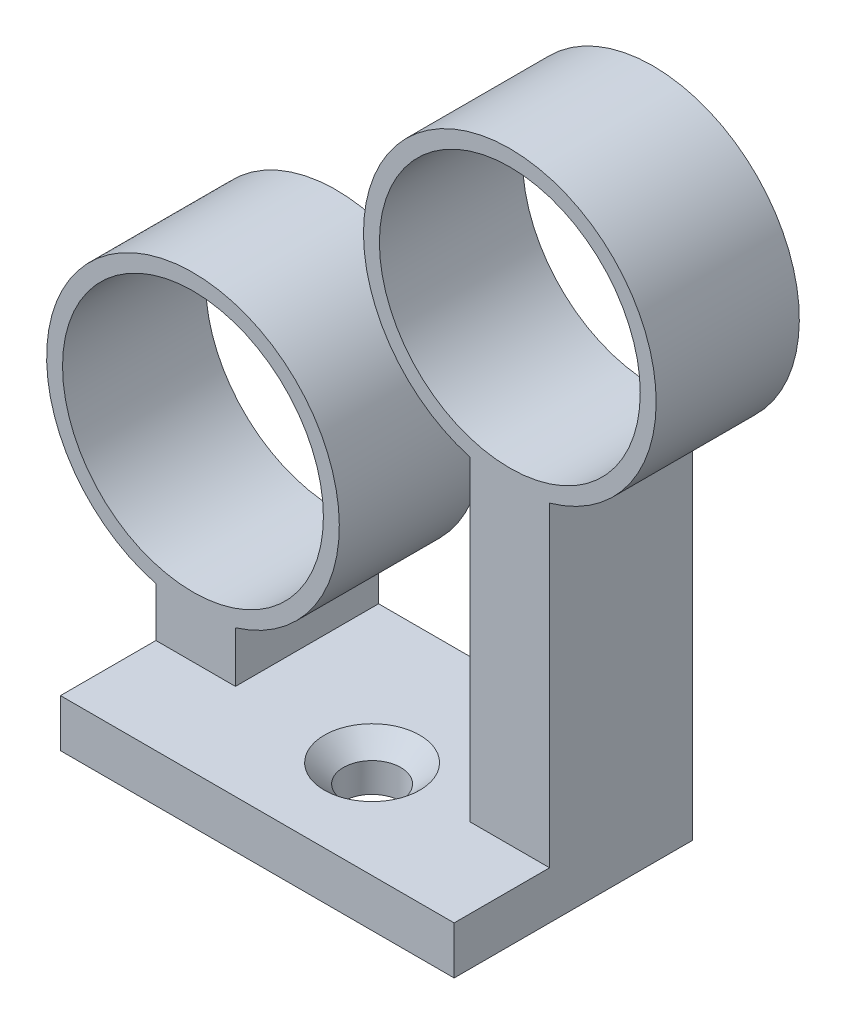
ISO-10303-21;
HEADER;
FILE_DESCRIPTION(('STEP AP214'),'2;1');
FILE_NAME('part.step','',(''),(''),'','','');
FILE_SCHEMA(('AUTOMOTIVE_DESIGN { 1 0 10303 214 1 1 1 1 }'));
ENDSEC;
DATA;
#1=APPLICATION_CONTEXT('core data for automotive mechanical design processes');
#2=APPLICATION_PROTOCOL_DEFINITION('international standard','automotive_design',2000,#1);
#3=PRODUCT_CONTEXT('',#1,'mechanical');
#4=PRODUCT('Part','Part','',(#3));
#5=PRODUCT_RELATED_PRODUCT_CATEGORY('part','',(#4));
#6=PRODUCT_DEFINITION_FORMATION('','',#4);
#7=PRODUCT_DEFINITION_CONTEXT('part definition',#1,'design');
#8=PRODUCT_DEFINITION('design','',#6,#7);
#9=PRODUCT_DEFINITION_SHAPE('','',#8);
#10=(LENGTH_UNIT() NAMED_UNIT(*) SI_UNIT(.MILLI.,.METRE.));
#11=(NAMED_UNIT(*) PLANE_ANGLE_UNIT() SI_UNIT($,.RADIAN.));
#12=(NAMED_UNIT(*) SI_UNIT($,.STERADIAN.) SOLID_ANGLE_UNIT());
#13=UNCERTAINTY_MEASURE_WITH_UNIT(LENGTH_MEASURE(1.E-05),#10,'distance_accuracy_value','');
#14=(GEOMETRIC_REPRESENTATION_CONTEXT(3) GLOBAL_UNCERTAINTY_ASSIGNED_CONTEXT((#13)) GLOBAL_UNIT_ASSIGNED_CONTEXT((#10,
#11,#12)) REPRESENTATION_CONTEXT('',''));
#15=CARTESIAN_POINT('',(0.,0.,0.));
#16=DIRECTION('',(0.,0.,1.));
#17=DIRECTION('',(1.,0.,0.));
#18=AXIS2_PLACEMENT_3D('',#15,#16,#17);
#19=CARTESIAN_POINT('',(2.62521602950088,39.8227863170303,9.));
#20=DIRECTION('',(0.,0.,1.));
#21=DIRECTION('',(1.,0.,0.));
#22=AXIS2_PLACEMENT_3D('',#19,#20,#21);
#23=PLANE('',#22);
#24=CARTESIAN_POINT('',(2.62521602950088,39.8227863170303,9.));
#25=DIRECTION('',(0.,0.,1.));
#26=DIRECTION('',(1.,0.,0.));
#27=AXIS2_PLACEMENT_3D('',#24,#25,#26);
#28=CIRCLE('',#27,8.2);
#29=CARTESIAN_POINT('',(10.8252160295009,39.8227863170303,9.));
#30=VERTEX_POINT('',#29);
#31=EDGE_CURVE('E186',#30,#30,#28,.T.);
#32=ORIENTED_EDGE('',*,*,#31,.F.);
#33=EDGE_LOOP('',(#32));
#34=FACE_BOUND('',#33,.T.);
#35=DIRECTION('',(0.,-1.,0.));
#36=VECTOR('',#35,1.);
#37=CARTESIAN_POINT('',(0.294979989954665,24.8227863170303,9.));
#38=LINE('',#37,#36);
#39=CARTESIAN_POINT('',(0.294979989954665,30.9227863170303,9.));
#40=VERTEX_POINT('',#39);
#41=CARTESIAN_POINT('',(0.294979989954665,27.8227863170303,9.));
#42=VERTEX_POINT('',#41);
#43=EDGE_CURVE('E60',#40,#42,#38,.T.);
#44=ORIENTED_EDGE('',*,*,#43,.T.);
#45=DIRECTION('',(1.,0.,0.));
#46=VECTOR('',#45,1.);
#47=CARTESIAN_POINT('',(2.62521602950088,27.8227863170303,9.));
#48=LINE('',#47,#46);
#49=CARTESIAN_POINT('',(5.29497998995467,27.8227863170303,9.));
#50=VERTEX_POINT('',#49);
#51=EDGE_CURVE('E164',#42,#50,#48,.T.);
#52=ORIENTED_EDGE('',*,*,#51,.T.);
#53=DIRECTION('',(0.,1.,0.));
#54=VECTOR('',#53,1.);
#55=CARTESIAN_POINT('',(5.29497998995467,24.8227863170303,9.));
#56=LINE('',#55,#54);
#57=CARTESIAN_POINT('',(5.29497998995467,31.0186758909019,9.));
#58=VERTEX_POINT('',#57);
#59=EDGE_CURVE('E169',#50,#58,#56,.T.);
#60=ORIENTED_EDGE('',*,*,#59,.T.);
#61=CARTESIAN_POINT('',(2.62521602950088,39.8227863170303,9.));
#62=DIRECTION('',(0.,0.,1.));
#63=DIRECTION('',(1.,0.,0.));
#64=AXIS2_PLACEMENT_3D('',#61,#62,#63);
#65=CIRCLE('',#64,9.2);
#66=EDGE_CURVE('E192',#58,#40,#65,.T.);
#67=ORIENTED_EDGE('',*,*,#66,.T.);
#68=EDGE_LOOP('',(#44,#52,#60,#67));
#69=FACE_BOUND('',#68,.T.);
#70=ADVANCED_FACE('F36',(#34,#69),#23,.T.);
#71=CARTESIAN_POINT('',(5.29497998995467,24.8227863170303,9.));
#72=DIRECTION('',(-1.,0.,0.));
#73=DIRECTION('',(0.,0.,1.));
#74=AXIS2_PLACEMENT_3D('',#71,#72,#73);
#75=PLANE('',#74);
#76=DIRECTION('',(0.,0.,1.));
#77=VECTOR('',#76,1.);
#78=CARTESIAN_POINT('',(5.29497998995467,27.8227863170303,9.));
#79=LINE('',#78,#77);
#80=CARTESIAN_POINT('',(5.29497998995467,27.8227863170303,0.));
#81=VERTEX_POINT('',#80);
#82=EDGE_CURVE('E194',#81,#50,#79,.T.);
#83=ORIENTED_EDGE('',*,*,#82,.F.);
#84=DIRECTION('',(0.,1.,0.));
#85=VECTOR('',#84,1.);
#86=CARTESIAN_POINT('',(5.29497998995467,24.8227863170303,0.));
#87=LINE('',#86,#85);
#88=CARTESIAN_POINT('',(5.29497998995467,31.0186758909019,0.));
#89=VERTEX_POINT('',#88);
#90=EDGE_CURVE('E170',#81,#89,#87,.T.);
#91=ORIENTED_EDGE('',*,*,#90,.T.);
#92=DIRECTION('',(0.,0.,-1.));
#93=VECTOR('',#92,1.);
#94=CARTESIAN_POINT('',(5.29497998995467,31.0186758909019,9.));
#95=LINE('',#94,#93);
#96=EDGE_CURVE('E179',#58,#89,#95,.T.);
#97=ORIENTED_EDGE('',*,*,#96,.F.);
#98=ORIENTED_EDGE('',*,*,#59,.F.);
#99=EDGE_LOOP('',(#83,#91,#97,#98));
#100=FACE_BOUND('',#99,.T.);
#101=ADVANCED_FACE('F229',(#100),#75,.F.);
#102=CARTESIAN_POINT('',(2.62521602950088,39.8227863170303,9.));
#103=DIRECTION('',(0.,0.,-1.));
#104=DIRECTION('',(-1.,0.,0.));
#105=AXIS2_PLACEMENT_3D('',#102,#103,#104);
#106=CYLINDRICAL_SURFACE('',#105,9.2);
#107=DIRECTION('',(0.,0.,-1.));
#108=VECTOR('',#107,1.);
#109=CARTESIAN_POINT('',(0.294979989954665,30.9227863170303,9.));
#110=LINE('',#109,#108);
#111=CARTESIAN_POINT('',(0.294979989954665,30.9227863170303,0.));
#112=VERTEX_POINT('',#111);
#113=EDGE_CURVE('E172',#40,#112,#110,.T.);
#114=ORIENTED_EDGE('',*,*,#113,.F.);
#115=ORIENTED_EDGE('',*,*,#66,.F.);
#116=ORIENTED_EDGE('',*,*,#96,.T.);
#117=CARTESIAN_POINT('',(2.62521602950088,39.8227863170303,0.));
#118=DIRECTION('',(0.,0.,1.));
#119=DIRECTION('',(1.,0.,0.));
#120=AXIS2_PLACEMENT_3D('',#117,#118,#119);
#121=CIRCLE('',#120,9.2);
#122=EDGE_CURVE('E189',#89,#112,#121,.T.);
#123=ORIENTED_EDGE('',*,*,#122,.T.);
#124=EDGE_LOOP('',(#114,#115,#116,#123));
#125=FACE_BOUND('',#124,.T.);
#126=ADVANCED_FACE('F38',(#125),#106,.T.);
#127=CARTESIAN_POINT('',(2.62521602950088,39.8227863170303,0.));
#128=DIRECTION('',(0.,0.,1.));
#129=DIRECTION('',(1.,0.,0.));
#130=AXIS2_PLACEMENT_3D('',#127,#128,#129);
#131=PLANE('',#130);
#132=DIRECTION('',(0.,-1.,0.));
#133=VECTOR('',#132,1.);
#134=CARTESIAN_POINT('',(25.0444504525403,27.8227863170303,0.));
#135=LINE('',#134,#133);
#136=CARTESIAN_POINT('',(25.0444504525403,47.6789735790061,0.));
#137=VERTEX_POINT('',#136);
#138=CARTESIAN_POINT('',(25.0444504525403,24.8227863170303,0.));
#139=VERTEX_POINT('',#138);
#140=EDGE_CURVE('E114',#137,#139,#135,.T.);
#141=ORIENTED_EDGE('',*,*,#140,.T.);
#142=DIRECTION('',(1.,0.,0.));
#143=VECTOR('',#142,1.);
#144=CARTESIAN_POINT('',(0.294979989954665,24.8227863170303,0.));
#145=LINE('',#144,#143);
#146=CARTESIAN_POINT('',(0.294979989954665,24.8227863170303,0.));
#147=VERTEX_POINT('',#146);
#148=EDGE_CURVE('E174',#147,#139,#145,.T.);
#149=ORIENTED_EDGE('',*,*,#148,.F.);
#150=DIRECTION('',(0.,-1.,0.));
#151=VECTOR('',#150,1.);
#152=CARTESIAN_POINT('',(0.294979989954665,24.8227863170303,0.));
#153=LINE('',#152,#151);
#154=EDGE_CURVE('E167',#112,#147,#153,.T.);
#155=ORIENTED_EDGE('',*,*,#154,.F.);
#156=ORIENTED_EDGE('',*,*,#122,.F.);
#157=ORIENTED_EDGE('',*,*,#90,.F.);
#158=DIRECTION('',(1.,0.,0.));
#159=VECTOR('',#158,1.);
#160=CARTESIAN_POINT('',(0.294979989954665,27.8227863170303,0.));
#161=LINE('',#160,#159);
#162=CARTESIAN_POINT('',(20.0444504525403,27.8227863170303,0.));
#163=VERTEX_POINT('',#162);
#164=EDGE_CURVE('E151',#81,#163,#161,.T.);
#165=ORIENTED_EDGE('',*,*,#164,.T.);
#166=DIRECTION('',(0.,-1.,0.));
#167=VECTOR('',#166,1.);
#168=CARTESIAN_POINT('',(20.0444504525403,47.7227863170303,0.));
#169=LINE('',#168,#167);
#170=CARTESIAN_POINT('',(20.0444504525403,47.6789735790061,0.));
#171=VERTEX_POINT('',#170);
#172=EDGE_CURVE('E131',#171,#163,#169,.T.);
#173=ORIENTED_EDGE('',*,*,#172,.F.);
#174=CARTESIAN_POINT('',(22.5444504525403,56.5327863170303,0.));
#175=DIRECTION('',(0.,0.,1.));
#176=DIRECTION('',(1.,0.,0.));
#177=AXIS2_PLACEMENT_3D('',#174,#175,#176);
#178=CIRCLE('',#177,9.2);
#179=EDGE_CURVE('E127',#137,#171,#178,.T.);
#180=ORIENTED_EDGE('',*,*,#179,.F.);
#181=EDGE_LOOP('',(#141,#149,#155,#156,#157,#165,#173,#180));
#182=FACE_BOUND('',#181,.T.);
#183=CARTESIAN_POINT('',(22.5444504525403,56.5327863170303,0.));
#184=DIRECTION('',(0.,0.,1.));
#185=DIRECTION('',(1.,0.,0.));
#186=AXIS2_PLACEMENT_3D('',#183,#184,#185);
#187=CIRCLE('',#186,8.2);
#188=CARTESIAN_POINT('',(30.7444504525403,56.5327863170303,0.));
#189=VERTEX_POINT('',#188);
#190=EDGE_CURVE('E141',#189,#189,#187,.T.);
#191=ORIENTED_EDGE('',*,*,#190,.T.);
#192=EDGE_LOOP('',(#191));
#193=FACE_BOUND('',#192,.T.);
#194=CARTESIAN_POINT('',(2.62521602950088,39.8227863170303,0.));
#195=DIRECTION('',(0.,0.,1.));
#196=DIRECTION('',(1.,0.,0.));
#197=AXIS2_PLACEMENT_3D('',#194,#195,#196);
#198=CIRCLE('',#197,8.2);
#199=CARTESIAN_POINT('',(10.8252160295009,39.8227863170303,0.));
#200=VERTEX_POINT('',#199);
#201=EDGE_CURVE('E185',#200,#200,#198,.T.);
#202=ORIENTED_EDGE('',*,*,#201,.T.);
#203=EDGE_LOOP('',(#202));
#204=FACE_BOUND('',#203,.T.);
#205=ADVANCED_FACE('F128',(#182,#193,#204),#131,.F.);
#206=CARTESIAN_POINT('',(2.62521602950088,39.8227863170303,9.));
#207=DIRECTION('',(0.,0.,-1.));
#208=DIRECTION('',(-1.,0.,0.));
#209=AXIS2_PLACEMENT_3D('',#206,#207,#208);
#210=CYLINDRICAL_SURFACE('',#209,8.2);
#211=ORIENTED_EDGE('',*,*,#31,.T.);
#212=EDGE_LOOP('',(#211));
#213=FACE_BOUND('',#212,.T.);
#214=ORIENTED_EDGE('',*,*,#201,.F.);
#215=EDGE_LOOP('',(#214));
#216=FACE_BOUND('',#215,.T.);
#217=ADVANCED_FACE('F246',(#213,#216),#210,.F.);
#218=CARTESIAN_POINT('',(0.294979989954665,24.8227863170303,9.));
#219=DIRECTION('',(1.,0.,0.));
#220=DIRECTION('',(0.,0.,-1.));
#221=AXIS2_PLACEMENT_3D('',#218,#219,#220);
#222=PLANE('',#221);
#223=DIRECTION('',(0.,0.,-1.));
#224=VECTOR('',#223,1.);
#225=CARTESIAN_POINT('',(0.294979989954665,24.8227863170303,9.));
#226=LINE('',#225,#224);
#227=CARTESIAN_POINT('',(0.294979989954665,24.8227863170303,15.));
#228=VERTEX_POINT('',#227);
#229=EDGE_CURVE('E182',#228,#147,#226,.T.);
#230=ORIENTED_EDGE('',*,*,#229,.F.);
#231=DIRECTION('',(0.,-1.,0.));
#232=VECTOR('',#231,1.);
#233=CARTESIAN_POINT('',(0.294979989954665,27.8227863170303,15.));
#234=LINE('',#233,#232);
#235=CARTESIAN_POINT('',(0.294979989954665,27.8227863170303,15.));
#236=VERTEX_POINT('',#235);
#237=EDGE_CURVE('E161',#236,#228,#234,.T.);
#238=ORIENTED_EDGE('',*,*,#237,.F.);
#239=DIRECTION('',(0.,0.,-1.));
#240=VECTOR('',#239,1.);
#241=CARTESIAN_POINT('',(0.294979989954665,27.8227863170303,15.));
#242=LINE('',#241,#240);
#243=EDGE_CURVE('E148',#236,#42,#242,.T.);
#244=ORIENTED_EDGE('',*,*,#243,.T.);
#245=ORIENTED_EDGE('',*,*,#43,.F.);
#246=ORIENTED_EDGE('',*,*,#113,.T.);
#247=ORIENTED_EDGE('',*,*,#154,.T.);
#248=EDGE_LOOP('',(#230,#238,#244,#245,#246,#247));
#249=FACE_BOUND('',#248,.T.);
#250=ADVANCED_FACE('F223',(#249),#222,.F.);
#251=CARTESIAN_POINT('',(0.294979989954665,24.8227863170303,9.));
#252=DIRECTION('',(0.,1.,0.));
#253=DIRECTION('',(-1.,0.,0.));
#254=AXIS2_PLACEMENT_3D('',#251,#252,#253);
#255=PLANE('',#254);
#256=CARTESIAN_POINT('',(13.7420244327474,24.8227863170303,8.85634248693543));
#257=DIRECTION('',(0.,1.,0.));
#258=DIRECTION('',(-1.,0.,0.));
#259=AXIS2_PLACEMENT_3D('',#256,#257,#258);
#260=CIRCLE('',#259,1.79999999999999);
#261=CARTESIAN_POINT('',(11.9420244327474,24.8227863170303,8.85634248693543));
#262=VERTEX_POINT('',#261);
#263=EDGE_CURVE('E40',#262,#262,#260,.T.);
#264=ORIENTED_EDGE('',*,*,#263,.T.);
#265=EDGE_LOOP('',(#264));
#266=FACE_BOUND('',#265,.T.);
#267=DIRECTION('',(0.,0.,1.));
#268=VECTOR('',#267,1.);
#269=CARTESIAN_POINT('',(25.0444504525403,24.8227863170303,15.));
#270=LINE('',#269,#268);
#271=CARTESIAN_POINT('',(25.0444504525403,24.8227863170303,15.));
#272=VERTEX_POINT('',#271);
#273=EDGE_CURVE('E120',#139,#272,#270,.T.);
#274=ORIENTED_EDGE('',*,*,#273,.T.);
#275=DIRECTION('',(-1.,0.,0.));
#276=VECTOR('',#275,1.);
#277=CARTESIAN_POINT('',(0.294979989954665,24.8227863170303,15.));
#278=LINE('',#277,#276);
#279=EDGE_CURVE('E152',#272,#228,#278,.T.);
#280=ORIENTED_EDGE('',*,*,#279,.T.);
#281=ORIENTED_EDGE('',*,*,#229,.T.);
#282=ORIENTED_EDGE('',*,*,#148,.T.);
#283=EDGE_LOOP('',(#274,#280,#281,#282));
#284=FACE_BOUND('',#283,.T.);
#285=ADVANCED_FACE('F218',(#266,#284),#255,.F.);
#286=CARTESIAN_POINT('',(0.294979989954665,27.8227863170303,15.));
#287=DIRECTION('',(0.,0.,1.));
#288=DIRECTION('',(1.,0.,0.));
#289=AXIS2_PLACEMENT_3D('',#286,#287,#288);
#290=PLANE('',#289);
#291=ORIENTED_EDGE('',*,*,#279,.F.);
#292=DIRECTION('',(0.,-1.,0.));
#293=VECTOR('',#292,1.);
#294=CARTESIAN_POINT('',(25.0444504525403,27.8227863170303,15.));
#295=LINE('',#294,#293);
#296=CARTESIAN_POINT('',(25.0444504525403,27.8227863170303,15.));
#297=VERTEX_POINT('',#296);
#298=EDGE_CURVE('E123',#297,#272,#295,.T.);
#299=ORIENTED_EDGE('',*,*,#298,.F.);
#300=DIRECTION('',(-1.,0.,0.));
#301=VECTOR('',#300,1.);
#302=CARTESIAN_POINT('',(0.294979989954665,27.8227863170303,15.));
#303=LINE('',#302,#301);
#304=EDGE_CURVE('E124',#297,#236,#303,.T.);
#305=ORIENTED_EDGE('',*,*,#304,.T.);
#306=ORIENTED_EDGE('',*,*,#237,.T.);
#307=EDGE_LOOP('',(#291,#299,#305,#306));
#308=FACE_BOUND('',#307,.T.);
#309=ADVANCED_FACE('F216',(#308),#290,.T.);
#310=CARTESIAN_POINT('',(25.0444504525403,27.8227863170303,15.));
#311=DIRECTION('',(1.,0.,0.));
#312=DIRECTION('',(0.,0.,-1.));
#313=AXIS2_PLACEMENT_3D('',#310,#311,#312);
#314=PLANE('',#313);
#315=ORIENTED_EDGE('',*,*,#298,.T.);
#316=ORIENTED_EDGE('',*,*,#273,.F.);
#317=ORIENTED_EDGE('',*,*,#140,.F.);
#318=DIRECTION('',(0.,0.,-1.));
#319=VECTOR('',#318,1.);
#320=CARTESIAN_POINT('',(25.0444504525403,47.6789735790061,9.));
#321=LINE('',#320,#319);
#322=CARTESIAN_POINT('',(25.0444504525403,47.6789735790061,9.));
#323=VERTEX_POINT('',#322);
#324=EDGE_CURVE('E119',#137,#323,#321,.F.);
#325=ORIENTED_EDGE('',*,*,#324,.T.);
#326=DIRECTION('',(0.,1.,0.));
#327=VECTOR('',#326,1.);
#328=CARTESIAN_POINT('',(25.0444504525403,47.7227863170303,9.));
#329=LINE('',#328,#327);
#330=CARTESIAN_POINT('',(25.0444504525403,27.8227863170303,9.));
#331=VERTEX_POINT('',#330);
#332=EDGE_CURVE('E52',#331,#323,#329,.T.);
#333=ORIENTED_EDGE('',*,*,#332,.F.);
#334=DIRECTION('',(0.,0.,1.));
#335=VECTOR('',#334,1.);
#336=CARTESIAN_POINT('',(25.0444504525403,27.8227863170303,15.));
#337=LINE('',#336,#335);
#338=EDGE_CURVE('E154',#331,#297,#337,.T.);
#339=ORIENTED_EDGE('',*,*,#338,.T.);
#340=EDGE_LOOP('',(#315,#316,#317,#325,#333,#339));
#341=FACE_BOUND('',#340,.T.);
#342=ADVANCED_FACE('F117',(#341),#314,.T.);
#343=CARTESIAN_POINT('',(0.,27.8227863170303,0.));
#344=DIRECTION('',(0.,-1.,0.));
#345=DIRECTION('',(0.,0.,-1.));
#346=AXIS2_PLACEMENT_3D('',#343,#344,#345);
#347=PLANE('',#346);
#348=CARTESIAN_POINT('',(13.7420244327474,27.8227863170303,8.85634248693543));
#349=DIRECTION('',(0.,1.,0.));
#350=DIRECTION('',(0.,0.,1.));
#351=AXIS2_PLACEMENT_3D('',#348,#349,#350);
#352=CIRCLE('',#351,3.);
#353=CARTESIAN_POINT('',(13.7420244327474,27.8227863170303,11.8563424869354));
#354=VERTEX_POINT('',#353);
#355=EDGE_CURVE('E433',#354,#354,#352,.T.);
#356=ORIENTED_EDGE('',*,*,#355,.F.);
#357=EDGE_LOOP('',(#356));
#358=FACE_BOUND('',#357,.T.);
#359=ORIENTED_EDGE('',*,*,#338,.F.);
#360=DIRECTION('',(-1.,0.,0.));
#361=VECTOR('',#360,1.);
#362=CARTESIAN_POINT('',(0.,27.8227863170303,9.));
#363=LINE('',#362,#361);
#364=CARTESIAN_POINT('',(20.0444504525403,27.8227863170303,9.));
#365=VERTEX_POINT('',#364);
#366=EDGE_CURVE('E11',#331,#365,#363,.T.);
#367=ORIENTED_EDGE('',*,*,#366,.T.);
#368=DIRECTION('',(0.,0.,1.));
#369=VECTOR('',#368,1.);
#370=CARTESIAN_POINT('',(20.0444504525403,27.8227863170303,0.));
#371=LINE('',#370,#369);
#372=EDGE_CURVE('E45',#163,#365,#371,.T.);
#373=ORIENTED_EDGE('',*,*,#372,.F.);
#374=ORIENTED_EDGE('',*,*,#164,.F.);
#375=ORIENTED_EDGE('',*,*,#82,.T.);
#376=ORIENTED_EDGE('',*,*,#51,.F.);
#377=ORIENTED_EDGE('',*,*,#243,.F.);
#378=ORIENTED_EDGE('',*,*,#304,.F.);
#379=EDGE_LOOP('',(#359,#367,#373,#374,#375,#376,#377,#378));
#380=FACE_BOUND('',#379,.T.);
#381=ADVANCED_FACE('F210',(#358,#380),#347,.F.);
#382=CARTESIAN_POINT('',(22.5444504525403,56.5327863170303,9.));
#383=DIRECTION('',(0.,0.,1.));
#384=DIRECTION('',(1.,0.,0.));
#385=AXIS2_PLACEMENT_3D('',#382,#383,#384);
#386=PLANE('',#385);
#387=CARTESIAN_POINT('',(22.5444504525403,56.5327863170303,9.));
#388=DIRECTION('',(0.,0.,1.));
#389=DIRECTION('',(1.,0.,0.));
#390=AXIS2_PLACEMENT_3D('',#387,#388,#389);
#391=CIRCLE('',#390,8.2);
#392=CARTESIAN_POINT('',(30.7444504525403,56.5327863170303,9.));
#393=VERTEX_POINT('',#392);
#394=EDGE_CURVE('E134',#393,#393,#391,.T.);
#395=ORIENTED_EDGE('',*,*,#394,.F.);
#396=EDGE_LOOP('',(#395));
#397=FACE_BOUND('',#396,.T.);
#398=ORIENTED_EDGE('',*,*,#366,.F.);
#399=ORIENTED_EDGE('',*,*,#332,.T.);
#400=CARTESIAN_POINT('',(22.5444504525403,56.5327863170303,9.));
#401=DIRECTION('',(0.,0.,1.));
#402=DIRECTION('',(1.,0.,0.));
#403=AXIS2_PLACEMENT_3D('',#400,#401,#402);
#404=CIRCLE('',#403,9.2);
#405=CARTESIAN_POINT('',(20.0444504525403,47.6789735790061,9.));
#406=VERTEX_POINT('',#405);
#407=EDGE_CURVE('E135',#323,#406,#404,.T.);
#408=ORIENTED_EDGE('',*,*,#407,.T.);
#409=DIRECTION('',(0.,-1.,0.));
#410=VECTOR('',#409,1.);
#411=CARTESIAN_POINT('',(20.0444504525403,47.7227863170303,9.));
#412=LINE('',#411,#410);
#413=EDGE_CURVE('E203',#406,#365,#412,.T.);
#414=ORIENTED_EDGE('',*,*,#413,.T.);
#415=EDGE_LOOP('',(#398,#399,#408,#414));
#416=FACE_BOUND('',#415,.T.);
#417=ADVANCED_FACE('F207',(#397,#416),#386,.T.);
#418=CARTESIAN_POINT('',(20.0444504525403,47.7227863170303,9.));
#419=DIRECTION('',(1.,0.,0.));
#420=DIRECTION('',(0.,1.,0.));
#421=AXIS2_PLACEMENT_3D('',#418,#419,#420);
#422=PLANE('',#421);
#423=ORIENTED_EDGE('',*,*,#172,.T.);
#424=ORIENTED_EDGE('',*,*,#372,.T.);
#425=ORIENTED_EDGE('',*,*,#413,.F.);
#426=DIRECTION('',(0.,0.,-1.));
#427=VECTOR('',#426,1.);
#428=CARTESIAN_POINT('',(20.0444504525403,47.6789735790061,9.));
#429=LINE('',#428,#427);
#430=EDGE_CURVE('E140',#406,#171,#429,.T.);
#431=ORIENTED_EDGE('',*,*,#430,.T.);
#432=EDGE_LOOP('',(#423,#424,#425,#431));
#433=FACE_BOUND('',#432,.T.);
#434=ADVANCED_FACE('F202',(#433),#422,.F.);
#435=CARTESIAN_POINT('',(22.5444504525403,56.5327863170303,9.));
#436=DIRECTION('',(0.,0.,-1.));
#437=DIRECTION('',(-1.,0.,0.));
#438=AXIS2_PLACEMENT_3D('',#435,#436,#437);
#439=CYLINDRICAL_SURFACE('',#438,9.2);
#440=ORIENTED_EDGE('',*,*,#430,.F.);
#441=ORIENTED_EDGE('',*,*,#407,.F.);
#442=ORIENTED_EDGE('',*,*,#324,.F.);
#443=ORIENTED_EDGE('',*,*,#179,.T.);
#444=EDGE_LOOP('',(#440,#441,#442,#443));
#445=FACE_BOUND('',#444,.T.);
#446=ADVANCED_FACE('F138',(#445),#439,.T.);
#447=CARTESIAN_POINT('',(22.5444504525403,56.5327863170303,9.));
#448=DIRECTION('',(0.,0.,-1.));
#449=DIRECTION('',(-1.,0.,0.));
#450=AXIS2_PLACEMENT_3D('',#447,#448,#449);
#451=CYLINDRICAL_SURFACE('',#450,8.2);
#452=ORIENTED_EDGE('',*,*,#394,.T.);
#453=EDGE_LOOP('',(#452));
#454=FACE_BOUND('',#453,.T.);
#455=ORIENTED_EDGE('',*,*,#190,.F.);
#456=EDGE_LOOP('',(#455));
#457=FACE_BOUND('',#456,.T.);
#458=ADVANCED_FACE('F304',(#454,#457),#451,.F.);
#459=CARTESIAN_POINT('',(13.7420244327474,27.8227863170303,8.85634248693543));
#460=DIRECTION('',(0.,1.,0.));
#461=DIRECTION('',(0.,0.,1.));
#462=AXIS2_PLACEMENT_3D('',#459,#460,#461);
#463=CYLINDRICAL_SURFACE('',#462,1.79999999999999);
#464=CARTESIAN_POINT('',(13.7420244327474,26.6639597872618,8.85634248693543));
#465=DIRECTION('',(0.,1.,0.));
#466=DIRECTION('',(0.,0.,1.));
#467=AXIS2_PLACEMENT_3D('',#464,#465,#466);
#468=CIRCLE('',#467,1.8);
#469=CARTESIAN_POINT('',(13.7420244327474,26.6639597872618,10.6563424869354));
#470=VERTEX_POINT('',#469);
#471=EDGE_CURVE('E430',#470,#470,#468,.T.);
#472=ORIENTED_EDGE('',*,*,#471,.T.);
#473=EDGE_LOOP('',(#472));
#474=FACE_BOUND('',#473,.T.);
#475=ORIENTED_EDGE('',*,*,#263,.F.);
#476=EDGE_LOOP('',(#475));
#477=FACE_BOUND('',#476,.T.);
#478=ADVANCED_FACE('F310',(#474,#477),#463,.F.);
#479=CARTESIAN_POINT('',(13.7420244327474,27.8227863170303,8.85634248693543));
#480=DIRECTION('',(0.,1.,0.));
#481=DIRECTION('',(0.,0.,1.));
#482=AXIS2_PLACEMENT_3D('',#479,#480,#481);
#483=CONICAL_SURFACE('',#482,3.,0.80285145591739);
#484=ORIENTED_EDGE('',*,*,#471,.F.);
#485=EDGE_LOOP('',(#484));
#486=FACE_BOUND('',#485,.T.);
#487=ORIENTED_EDGE('',*,*,#355,.T.);
#488=EDGE_LOOP('',(#487));
#489=FACE_BOUND('',#488,.T.);
#490=ADVANCED_FACE('F317',(#486,#489),#483,.F.);
#491=CLOSED_SHELL('',(#70,#101,#126,#205,#217,#250,#285,#309,#342,#381,#417,#434,#446,#458,#478,#490));
#492=MANIFOLD_SOLID_BREP('B2',#491);
#493=ADVANCED_BREP_SHAPE_REPRESENTATION('',(#18,#492),#14);
#494=SHAPE_DEFINITION_REPRESENTATION(#9,#493);
ENDSEC;
END-ISO-10303-21;
